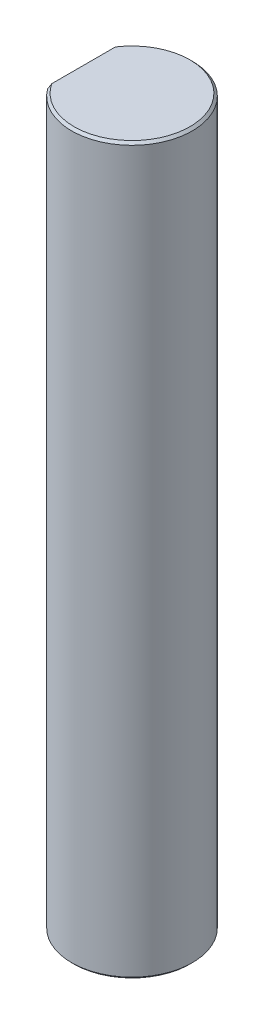
ISO-10303-21;
HEADER;
FILE_DESCRIPTION(('STEP AP214'),'2;1');
FILE_NAME('part.step','',(''),(''),'','','');
FILE_SCHEMA(('AUTOMOTIVE_DESIGN { 1 0 10303 214 1 1 1 1 }'));
ENDSEC;
DATA;
#1=APPLICATION_CONTEXT('core data for automotive mechanical design processes');
#2=APPLICATION_PROTOCOL_DEFINITION('international standard','automotive_design',2000,#1);
#3=PRODUCT_CONTEXT('',#1,'mechanical');
#4=PRODUCT('Part','Part','',(#3));
#5=PRODUCT_RELATED_PRODUCT_CATEGORY('part','',(#4));
#6=PRODUCT_DEFINITION_FORMATION('','',#4);
#7=PRODUCT_DEFINITION_CONTEXT('part definition',#1,'design');
#8=PRODUCT_DEFINITION('design','',#6,#7);
#9=PRODUCT_DEFINITION_SHAPE('','',#8);
#10=(LENGTH_UNIT() NAMED_UNIT(*) SI_UNIT(.MILLI.,.METRE.));
#11=(NAMED_UNIT(*) PLANE_ANGLE_UNIT() SI_UNIT($,.RADIAN.));
#12=(NAMED_UNIT(*) SI_UNIT($,.STERADIAN.) SOLID_ANGLE_UNIT());
#13=UNCERTAINTY_MEASURE_WITH_UNIT(LENGTH_MEASURE(1.E-05),#10,'distance_accuracy_value','');
#14=(GEOMETRIC_REPRESENTATION_CONTEXT(3) GLOBAL_UNCERTAINTY_ASSIGNED_CONTEXT((#13)) GLOBAL_UNIT_ASSIGNED_CONTEXT((#10,
#11,#12)) REPRESENTATION_CONTEXT('',''));
#15=CARTESIAN_POINT('',(0.,0.,0.));
#16=DIRECTION('',(0.,0.,1.));
#17=DIRECTION('',(1.,0.,0.));
#18=AXIS2_PLACEMENT_3D('',#15,#16,#17);
#19=CARTESIAN_POINT('',(-2.54381,38.1,-1.89353550270387));
#20=DIRECTION('',(1.,0.,0.));
#21=DIRECTION('',(0.,0.,-1.));
#22=AXIS2_PLACEMENT_3D('',#19,#20,#21);
#23=PLANE('',#22);
#24=DIRECTION('',(0.,0.,1.));
#25=VECTOR('',#24,1.);
#26=CARTESIAN_POINT('',(-2.54381,38.1,1.89353550270387));
#27=LINE('',#26,#25);
#28=CARTESIAN_POINT('',(-2.54381,38.1,-1.67216130799275));
#29=VERTEX_POINT('',#28);
#30=CARTESIAN_POINT('',(-2.54381,38.1,1.67216130799275));
#31=VERTEX_POINT('',#30);
#32=EDGE_CURVE('E138',#29,#31,#27,.T.);
#33=ORIENTED_EDGE('',*,*,#32,.F.);
#34=CARTESIAN_POINT('',(-2.54381,38.1,-1.67216130799275));
#35=CARTESIAN_POINT('',(-2.54381,38.0794966626708,-1.70943763305508));
#36=CARTESIAN_POINT('',(-2.54381,38.0586616426416,-1.74652367530513));
#37=CARTESIAN_POINT('',(-2.54381,38.0163283071138,-1.82031507228486));
#38=CARTESIAN_POINT('',(-2.54381,37.9948299938068,-1.85702042827186));
#39=CARTESIAN_POINT('',(-2.54381,37.9729999999915,-1.89353550270387));
#40=B_SPLINE_CURVE_WITH_KNOTS('',3,(#34,#35,#36,#37,#38,#39),.UNSPECIFIED.,.F.,.F.,(4,2,4),(0.,
0.127613687763027,0.255226953917525),.UNSPECIFIED.);
#41=CARTESIAN_POINT('',(-2.54381,37.9729999999915,-1.89353550270387));
#42=VERTEX_POINT('',#41);
#43=EDGE_CURVE('E49',#29,#42,#40,.T.);
#44=ORIENTED_EDGE('',*,*,#43,.T.);
#45=DIRECTION('',(0.,-1.,0.));
#46=VECTOR('',#45,1.);
#47=CARTESIAN_POINT('',(-2.54381,38.1,-1.89353550270387));
#48=LINE('',#47,#46);
#49=CARTESIAN_POINT('',(-2.54381,0.12700000001567,-1.89353550270387));
#50=VERTEX_POINT('',#49);
#51=EDGE_CURVE('E77',#42,#50,#48,.T.);
#52=ORIENTED_EDGE('',*,*,#51,.T.);
#53=CARTESIAN_POINT('',(-2.54381000001068,-1.27851288583836E-11,-1.67216130801526));
#54=CARTESIAN_POINT('',(-2.54381000047101,0.00501411434222985,-1.68128955354611));
#55=CARTESIAN_POINT('',(-2.54381000887065,0.0100502469805657,-1.69040569791067));
#56=CARTESIAN_POINT('',(-2.54381003270717,0.0201953225897199,-1.70866787818296));
#57=CARTESIAN_POINT('',(-2.5438100481853,0.0253045198860524,-1.71781377281351));
#58=CARTESIAN_POINT('',(-2.54381007720674,0.0355957200158609,-1.73613598519255));
#59=CARTESIAN_POINT('',(-2.54381009073801,0.0407779749891897,-1.74531216130338));
#60=CARTESIAN_POINT('',(-2.54381011031486,0.0512152945577694,-1.76369545380999));
#61=CARTESIAN_POINT('',(-2.5438101163153,0.0564706090657519,-1.77290242830561));
#62=CARTESIAN_POINT('',(-2.54381011826438,0.0670540493516978,-1.791347820477));
#63=CARTESIAN_POINT('',(-2.54381011415259,0.072382422716319,-1.80058609608331));
#64=CARTESIAN_POINT('',(-2.54381009710235,0.0831119837066534,-1.81909457920007));
#65=CARTESIAN_POINT('',(-2.54381008411096,0.0885134165259827,-1.82836464456));
#66=CARTESIAN_POINT('',(-2.5438100542958,0.0993890969662855,-1.84693718224481));
#67=CARTESIAN_POINT('',(-2.54381003744936,0.10486358730686,-1.85623951242386));
#68=CARTESIAN_POINT('',(-2.54381001068715,0.115885392288033,-1.87487704007127));
#69=CARTESIAN_POINT('',(-2.54381000081395,0.121432947170628,-1.88421209547216));
#70=CARTESIAN_POINT('',(-2.54380999998745,0.127000000015668,-1.89353550269454));
#71=B_SPLINE_CURVE_WITH_KNOTS('',3,(#53,#54,#55,#56,#57,#58,#59,#60,#61,#62,#63,#64,#65,#66,#67,
#68,#69,#70),.UNSPECIFIED.,.F.,.F.,(4,2,2,2,2,2,2,2,4),(0.,0.0312440948710332,
0.0626726522425758,0.094287754919129,0.126091425331957,0.158085626731133,0.190272264378751,
0.222653186741559,0.255230186681205),.UNSPECIFIED.);
#72=CARTESIAN_POINT('',(-2.54381000001068,0.,-1.67216130803853));
#73=VERTEX_POINT('',#72);
#74=EDGE_CURVE('E80',#73,#50,#71,.T.);
#75=ORIENTED_EDGE('',*,*,#74,.F.);
#76=DIRECTION('',(0.,0.,-1.));
#77=VECTOR('',#76,1.);
#78=CARTESIAN_POINT('',(-2.54381,0.,-1.89353550270387));
#79=LINE('',#78,#77);
#80=CARTESIAN_POINT('',(-2.54381000000534,-6.39246956150169E-12,1.67216130803502));
#81=VERTEX_POINT('',#80);
#82=EDGE_CURVE('E94',#81,#73,#79,.T.);
#83=ORIENTED_EDGE('',*,*,#82,.F.);
#84=CARTESIAN_POINT('',(-2.54380999998745,0.127000000015668,1.89353550269453));
#85=CARTESIAN_POINT('',(-2.54381000081395,0.121432947170633,1.88421209547217));
#86=CARTESIAN_POINT('',(-2.54381001068715,0.115885392288042,1.87487704007128));
#87=CARTESIAN_POINT('',(-2.54381003744936,0.104863587306876,1.85623951242389));
#88=CARTESIAN_POINT('',(-2.54381005429579,0.0993890969663044,1.84693718224485));
#89=CARTESIAN_POINT('',(-2.54381008411096,0.088513416526007,1.82836464456004));
#90=CARTESIAN_POINT('',(-2.54381009710235,0.0831119837066804,1.81909457920012));
#91=CARTESIAN_POINT('',(-2.54381011415259,0.0723824227163486,1.80058609608336));
#92=CARTESIAN_POINT('',(-2.54381011826438,0.0670540493517271,1.79134782047705));
#93=CARTESIAN_POINT('',(-2.5438101163153,0.0564706090657813,1.77290242830565));
#94=CARTESIAN_POINT('',(-2.54381011031486,0.051215294557799,1.76369545381004));
#95=CARTESIAN_POINT('',(-2.54381009073802,0.0407779749892169,1.74531216130342));
#96=CARTESIAN_POINT('',(-2.54381007720674,0.0355957200158855,1.73613598519259));
#97=CARTESIAN_POINT('',(-2.5438100481853,0.0253045198860715,1.71781377281354));
#98=CARTESIAN_POINT('',(-2.54381003270717,0.0201953225897362,1.70866787818299));
#99=CARTESIAN_POINT('',(-2.54381000887065,0.010050246980575,1.69040569791068));
#100=CARTESIAN_POINT('',(-2.54381000047101,0.00501411434223493,1.68128955354611));
#101=CARTESIAN_POINT('',(-2.54381000001068,-1.27849391230034E-11,1.67216130801526));
#102=B_SPLINE_CURVE_WITH_KNOTS('',3,(#84,#85,#86,#87,#88,#89,#90,#91,#92,#93,#94,#95,#96,#97,
#98,#99,#100,#101),.UNSPECIFIED.,.F.,.F.,(4,2,2,2,2,2,2,2,4),(0.,0.03257699993962,
0.0649579223024075,0.0971445599500176,0.129138761349188,0.160942431762022,0.192557534438583,
0.223986091810144,0.255230186681205),.UNSPECIFIED.);
#103=CARTESIAN_POINT('',(-2.54380999999373,0.127000000007849,1.8935355026992));
#104=VERTEX_POINT('',#103);
#105=EDGE_CURVE('E82',#104,#81,#102,.T.);
#106=ORIENTED_EDGE('',*,*,#105,.F.);
#107=DIRECTION('',(0.,-1.,0.));
#108=VECTOR('',#107,1.);
#109=CARTESIAN_POINT('',(-2.54381,38.1,1.89353550270387));
#110=LINE('',#109,#108);
#111=CARTESIAN_POINT('',(-2.54381,37.9729999999915,1.89353550270387));
#112=VERTEX_POINT('',#111);
#113=EDGE_CURVE('E83',#112,#104,#110,.T.);
#114=ORIENTED_EDGE('',*,*,#113,.F.);
#115=CARTESIAN_POINT('',(-2.54381,37.9729999999915,1.89353550270387));
#116=CARTESIAN_POINT('',(-2.54381,37.9948299938068,1.85702042827186));
#117=CARTESIAN_POINT('',(-2.54381,38.0163283071138,1.82031507228486));
#118=CARTESIAN_POINT('',(-2.54381,38.0586616426416,1.74652367530513));
#119=CARTESIAN_POINT('',(-2.54381,38.0794966626708,1.70943763305509));
#120=CARTESIAN_POINT('',(-2.54381,38.1,1.67216130799275));
#121=B_SPLINE_CURVE_WITH_KNOTS('',3,(#115,#116,#117,#118,#119,#120),.UNSPECIFIED.,.F.,.F.,(4,2,
4),(0.,0.1276132661545,0.255226953917527),.UNSPECIFIED.);
#122=EDGE_CURVE('E104',#112,#31,#121,.T.);
#123=ORIENTED_EDGE('',*,*,#122,.T.);
#124=EDGE_LOOP('',(#33,#44,#52,#75,#83,#106,#114,#123));
#125=FACE_BOUND('',#124,.T.);
#126=ADVANCED_FACE('F40',(#125),#23,.F.);
#127=CARTESIAN_POINT('',(0.,0.,0.));
#128=DIRECTION('',(0.,1.,0.));
#129=DIRECTION('',(0.,0.,1.));
#130=AXIS2_PLACEMENT_3D('',#127,#128,#129);
#131=PLANE('',#130);
#132=ORIENTED_EDGE('',*,*,#82,.T.);
#133=CARTESIAN_POINT('',(0.,0.,0.));
#134=DIRECTION('',(0.,1.,0.));
#135=DIRECTION('',(0.,0.,1.));
#136=AXIS2_PLACEMENT_3D('',#133,#134,#135);
#137=CIRCLE('',#136,3.04419000002554);
#138=EDGE_CURVE('E91',#81,#73,#137,.T.);
#139=ORIENTED_EDGE('',*,*,#138,.F.);
#140=EDGE_LOOP('',(#132,#139));
#141=FACE_BOUND('',#140,.T.);
#142=ADVANCED_FACE('F123',(#141),#131,.F.);
#143=CARTESIAN_POINT('',(0.,0.127000000020416,0.));
#144=DIRECTION('',(0.,1.,0.));
#145=DIRECTION('',(0.,0.,1.));
#146=AXIS2_PLACEMENT_3D('',#143,#144,#145);
#147=CONICAL_SURFACE('',#146,3.17118999998911,0.785398163173655);
#148=CARTESIAN_POINT('',(0.,0.127000000000037,0.));
#149=DIRECTION('',(0.,-1.,0.));
#150=DIRECTION('',(0.,0.,-1.));
#151=AXIS2_PLACEMENT_3D('',#148,#149,#150);
#152=CIRCLE('',#151,3.17119);
#153=EDGE_CURVE('E89',#104,#50,#152,.F.);
#154=ORIENTED_EDGE('',*,*,#153,.F.);
#155=ORIENTED_EDGE('',*,*,#105,.T.);
#156=ORIENTED_EDGE('',*,*,#138,.T.);
#157=ORIENTED_EDGE('',*,*,#74,.T.);
#158=EDGE_LOOP('',(#154,#155,#156,#157));
#159=FACE_BOUND('',#158,.T.);
#160=ADVANCED_FACE('F87',(#159),#147,.T.);
#161=CARTESIAN_POINT('',(0.,38.1,0.));
#162=DIRECTION('',(0.,-1.,0.));
#163=DIRECTION('',(0.,0.,-1.));
#164=AXIS2_PLACEMENT_3D('',#161,#162,#163);
#165=CYLINDRICAL_SURFACE('',#164,3.17119);
#166=ORIENTED_EDGE('',*,*,#51,.F.);
#167=CARTESIAN_POINT('',(0.,37.9729999999915,0.));
#168=DIRECTION('',(0.,-1.,0.));
#169=DIRECTION('',(0.,0.,-1.));
#170=AXIS2_PLACEMENT_3D('',#167,#168,#169);
#171=CIRCLE('',#170,3.17119);
#172=EDGE_CURVE('E12',#42,#112,#171,.T.);
#173=ORIENTED_EDGE('',*,*,#172,.T.);
#174=ORIENTED_EDGE('',*,*,#113,.T.);
#175=ORIENTED_EDGE('',*,*,#153,.T.);
#176=EDGE_LOOP('',(#166,#173,#174,#175));
#177=FACE_BOUND('',#176,.T.);
#178=ADVANCED_FACE('F96',(#177),#165,.T.);
#179=CARTESIAN_POINT('',(0.,38.1,0.));
#180=DIRECTION('',(0.,-1.,0.));
#181=DIRECTION('',(0.,0.,-1.));
#182=AXIS2_PLACEMENT_3D('',#179,#180,#181);
#183=PLANE('',#182);
#184=ORIENTED_EDGE('',*,*,#32,.T.);
#185=CARTESIAN_POINT('',(0.,38.1,0.));
#186=DIRECTION('',(0.,-1.,0.));
#187=DIRECTION('',(0.,0.,-1.));
#188=AXIS2_PLACEMENT_3D('',#185,#186,#187);
#189=CIRCLE('',#188,3.04418999999146);
#190=EDGE_CURVE('E98',#31,#29,#189,.F.);
#191=ORIENTED_EDGE('',*,*,#190,.T.);
#192=EDGE_LOOP('',(#184,#191));
#193=FACE_BOUND('',#192,.T.);
#194=ADVANCED_FACE('F142',(#193),#183,.F.);
#195=CARTESIAN_POINT('',(0.,38.1,0.));
#196=DIRECTION('',(0.,-1.,0.));
#197=DIRECTION('',(0.,0.,-1.));
#198=AXIS2_PLACEMENT_3D('',#195,#196,#197);
#199=CONICAL_SURFACE('',#198,3.04418999999146,0.785398163397457);
#200=ORIENTED_EDGE('',*,*,#122,.F.);
#201=ORIENTED_EDGE('',*,*,#172,.F.);
#202=ORIENTED_EDGE('',*,*,#43,.F.);
#203=ORIENTED_EDGE('',*,*,#190,.F.);
#204=EDGE_LOOP('',(#200,#201,#202,#203));
#205=FACE_BOUND('',#204,.T.);
#206=ADVANCED_FACE('F42',(#205),#199,.T.);
#207=CLOSED_SHELL('',(#126,#142,#160,#178,#194,#206));
#208=MANIFOLD_SOLID_BREP('B2',#207);
#209=ADVANCED_BREP_SHAPE_REPRESENTATION('',(#18,#208),#14);
#210=SHAPE_DEFINITION_REPRESENTATION(#9,#209);
ENDSEC;
END-ISO-10303-21;
